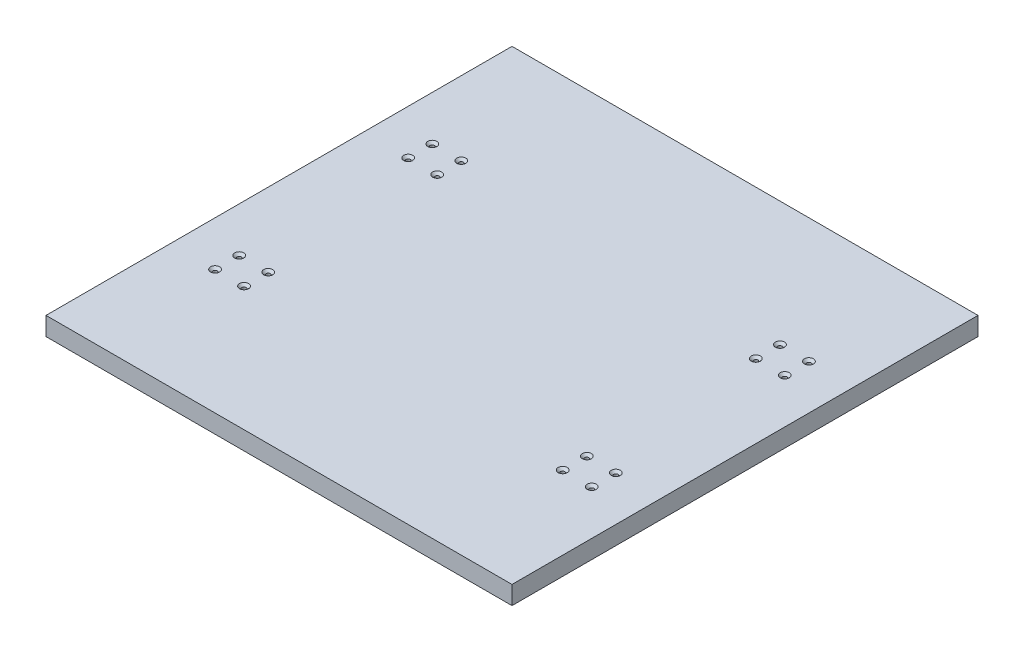
ISO-10303-21;
HEADER;
FILE_DESCRIPTION(('STEP AP214'),'2;1');
FILE_NAME('part.step','',(''),(''),'','','');
FILE_SCHEMA(('AUTOMOTIVE_DESIGN { 1 0 10303 214 1 1 1 1 }'));
ENDSEC;
DATA;
#1=APPLICATION_CONTEXT('core data for automotive mechanical design processes');
#2=APPLICATION_PROTOCOL_DEFINITION('international standard','automotive_design',2000,#1);
#3=PRODUCT_CONTEXT('',#1,'mechanical');
#4=PRODUCT('Part','Part','',(#3));
#5=PRODUCT_RELATED_PRODUCT_CATEGORY('part','',(#4));
#6=PRODUCT_DEFINITION_FORMATION('','',#4);
#7=PRODUCT_DEFINITION_CONTEXT('part definition',#1,'design');
#8=PRODUCT_DEFINITION('design','',#6,#7);
#9=PRODUCT_DEFINITION_SHAPE('','',#8);
#10=(LENGTH_UNIT() NAMED_UNIT(*) SI_UNIT(.MILLI.,.METRE.));
#11=(NAMED_UNIT(*) PLANE_ANGLE_UNIT() SI_UNIT($,.RADIAN.));
#12=(NAMED_UNIT(*) SI_UNIT($,.STERADIAN.) SOLID_ANGLE_UNIT());
#13=UNCERTAINTY_MEASURE_WITH_UNIT(LENGTH_MEASURE(1.E-05),#10,'distance_accuracy_value','');
#14=(GEOMETRIC_REPRESENTATION_CONTEXT(3) GLOBAL_UNCERTAINTY_ASSIGNED_CONTEXT((#13)) GLOBAL_UNIT_ASSIGNED_CONTEXT((#10,
#11,#12)) REPRESENTATION_CONTEXT('',''));
#15=CARTESIAN_POINT('',(0.,0.,0.));
#16=DIRECTION('',(0.,0.,1.));
#17=DIRECTION('',(1.,0.,0.));
#18=AXIS2_PLACEMENT_3D('',#15,#16,#17);
#19=CARTESIAN_POINT('',(-241.3,19.05,241.3));
#20=DIRECTION('',(1.,0.,0.));
#21=DIRECTION('',(0.,0.,-1.));
#22=AXIS2_PLACEMENT_3D('',#19,#20,#21);
#23=PLANE('',#22);
#24=DIRECTION('',(0.,0.,1.));
#25=VECTOR('',#24,1.);
#26=CARTESIAN_POINT('',(-241.3,0.,241.3));
#27=LINE('',#26,#25);
#28=CARTESIAN_POINT('',(-241.3,0.,-241.3));
#29=VERTEX_POINT('',#28);
#30=CARTESIAN_POINT('',(-241.3,0.,241.3));
#31=VERTEX_POINT('',#30);
#32=EDGE_CURVE('E108',#29,#31,#27,.T.);
#33=ORIENTED_EDGE('',*,*,#32,.T.);
#34=DIRECTION('',(0.,-1.,0.));
#35=VECTOR('',#34,1.);
#36=CARTESIAN_POINT('',(-241.3,19.05,241.3));
#37=LINE('',#36,#35);
#38=CARTESIAN_POINT('',(-241.3,19.05,241.3));
#39=VERTEX_POINT('',#38);
#40=EDGE_CURVE('E11',#39,#31,#37,.T.);
#41=ORIENTED_EDGE('',*,*,#40,.F.);
#42=DIRECTION('',(0.,0.,1.));
#43=VECTOR('',#42,1.);
#44=CARTESIAN_POINT('',(-241.3,19.05,241.3));
#45=LINE('',#44,#43);
#46=CARTESIAN_POINT('',(-241.3,19.05,-241.3));
#47=VERTEX_POINT('',#46);
#48=EDGE_CURVE('E92',#47,#39,#45,.T.);
#49=ORIENTED_EDGE('',*,*,#48,.F.);
#50=DIRECTION('',(0.,-1.,0.));
#51=VECTOR('',#50,1.);
#52=CARTESIAN_POINT('',(-241.3,19.05,-241.3));
#53=LINE('',#52,#51);
#54=EDGE_CURVE('E105',#47,#29,#53,.T.);
#55=ORIENTED_EDGE('',*,*,#54,.T.);
#56=EDGE_LOOP('',(#33,#41,#49,#55));
#57=FACE_BOUND('',#56,.T.);
#58=ADVANCED_FACE('F43',(#57),#23,.F.);
#59=CARTESIAN_POINT('',(241.3,19.05,241.3));
#60=DIRECTION('',(0.,0.,-1.));
#61=DIRECTION('',(-1.,0.,0.));
#62=AXIS2_PLACEMENT_3D('',#59,#60,#61);
#63=PLANE('',#62);
#64=DIRECTION('',(1.,0.,0.));
#65=VECTOR('',#64,1.);
#66=CARTESIAN_POINT('',(241.3,0.,241.3));
#67=LINE('',#66,#65);
#68=CARTESIAN_POINT('',(241.3,0.,241.3));
#69=VERTEX_POINT('',#68);
#70=EDGE_CURVE('E97',#31,#69,#67,.T.);
#71=ORIENTED_EDGE('',*,*,#70,.T.);
#72=DIRECTION('',(0.,-1.,0.));
#73=VECTOR('',#72,1.);
#74=CARTESIAN_POINT('',(241.3,19.05,241.3));
#75=LINE('',#74,#73);
#76=CARTESIAN_POINT('',(241.3,19.05,241.3));
#77=VERTEX_POINT('',#76);
#78=EDGE_CURVE('E51',#77,#69,#75,.T.);
#79=ORIENTED_EDGE('',*,*,#78,.F.);
#80=DIRECTION('',(1.,0.,0.));
#81=VECTOR('',#80,1.);
#82=CARTESIAN_POINT('',(241.3,19.05,241.3));
#83=LINE('',#82,#81);
#84=EDGE_CURVE('E87',#39,#77,#83,.T.);
#85=ORIENTED_EDGE('',*,*,#84,.F.);
#86=ORIENTED_EDGE('',*,*,#40,.T.);
#87=EDGE_LOOP('',(#71,#79,#85,#86));
#88=FACE_BOUND('',#87,.T.);
#89=ADVANCED_FACE('F100',(#88),#63,.F.);
#90=CARTESIAN_POINT('',(241.3,19.05,241.3));
#91=DIRECTION('',(-1.,0.,0.));
#92=DIRECTION('',(0.,0.,1.));
#93=AXIS2_PLACEMENT_3D('',#90,#91,#92);
#94=PLANE('',#93);
#95=DIRECTION('',(0.,0.,-1.));
#96=VECTOR('',#95,1.);
#97=CARTESIAN_POINT('',(241.3,0.,241.3));
#98=LINE('',#97,#96);
#99=CARTESIAN_POINT('',(241.3,0.,-241.3));
#100=VERTEX_POINT('',#99);
#101=EDGE_CURVE('E78',#69,#100,#98,.T.);
#102=ORIENTED_EDGE('',*,*,#101,.T.);
#103=DIRECTION('',(0.,-1.,0.));
#104=VECTOR('',#103,1.);
#105=CARTESIAN_POINT('',(241.3,19.05,-241.3));
#106=LINE('',#105,#104);
#107=CARTESIAN_POINT('',(241.3,19.05,-241.3));
#108=VERTEX_POINT('',#107);
#109=EDGE_CURVE('E98',#108,#100,#106,.T.);
#110=ORIENTED_EDGE('',*,*,#109,.F.);
#111=DIRECTION('',(0.,0.,-1.));
#112=VECTOR('',#111,1.);
#113=CARTESIAN_POINT('',(241.3,19.05,241.3));
#114=LINE('',#113,#112);
#115=EDGE_CURVE('E95',#77,#108,#114,.T.);
#116=ORIENTED_EDGE('',*,*,#115,.F.);
#117=ORIENTED_EDGE('',*,*,#78,.T.);
#118=EDGE_LOOP('',(#102,#110,#116,#117));
#119=FACE_BOUND('',#118,.T.);
#120=ADVANCED_FACE('F99',(#119),#94,.F.);
#121=CARTESIAN_POINT('',(241.3,19.05,-241.3));
#122=DIRECTION('',(0.,0.,1.));
#123=DIRECTION('',(1.,0.,0.));
#124=AXIS2_PLACEMENT_3D('',#121,#122,#123);
#125=PLANE('',#124);
#126=DIRECTION('',(-1.,0.,0.));
#127=VECTOR('',#126,1.);
#128=CARTESIAN_POINT('',(241.3,0.,-241.3));
#129=LINE('',#128,#127);
#130=EDGE_CURVE('E85',#100,#29,#129,.T.);
#131=ORIENTED_EDGE('',*,*,#130,.T.);
#132=ORIENTED_EDGE('',*,*,#54,.F.);
#133=DIRECTION('',(-1.,0.,0.));
#134=VECTOR('',#133,1.);
#135=CARTESIAN_POINT('',(241.3,19.05,-241.3));
#136=LINE('',#135,#134);
#137=EDGE_CURVE('E56',#108,#47,#136,.T.);
#138=ORIENTED_EDGE('',*,*,#137,.F.);
#139=ORIENTED_EDGE('',*,*,#109,.T.);
#140=EDGE_LOOP('',(#131,#132,#138,#139));
#141=FACE_BOUND('',#140,.T.);
#142=ADVANCED_FACE('F114',(#141),#125,.F.);
#143=CARTESIAN_POINT('',(0.,19.05,0.));
#144=DIRECTION('',(0.,1.,0.));
#145=DIRECTION('',(0.,0.,1.));
#146=AXIS2_PLACEMENT_3D('',#143,#144,#145);
#147=PLANE('',#146);
#148=CARTESIAN_POINT('',(-195.,19.05,87.5));
#149=DIRECTION('',(0.,1.,0.));
#150=DIRECTION('',(0.,0.,1.));
#151=AXIS2_PLACEMENT_3D('',#148,#149,#150);
#152=CIRCLE('',#151,4.70000000000001);
#153=CARTESIAN_POINT('',(-195.,19.05,92.2));
#154=VERTEX_POINT('',#153);
#155=EDGE_CURVE('E259',#154,#154,#152,.T.);
#156=ORIENTED_EDGE('',*,*,#155,.F.);
#157=EDGE_LOOP('',(#156));
#158=FACE_BOUND('',#157,.T.);
#159=CARTESIAN_POINT('',(-165.,19.05,87.5));
#160=DIRECTION('',(0.,1.,0.));
#161=DIRECTION('',(0.,0.,1.));
#162=AXIS2_PLACEMENT_3D('',#159,#160,#161);
#163=CIRCLE('',#162,4.70000000000001);
#164=CARTESIAN_POINT('',(-165.,19.05,92.2));
#165=VERTEX_POINT('',#164);
#166=EDGE_CURVE('E253',#165,#165,#163,.T.);
#167=ORIENTED_EDGE('',*,*,#166,.F.);
#168=EDGE_LOOP('',(#167));
#169=FACE_BOUND('',#168,.T.);
#170=CARTESIAN_POINT('',(-165.,19.05,112.5));
#171=DIRECTION('',(0.,1.,0.));
#172=DIRECTION('',(0.,0.,1.));
#173=AXIS2_PLACEMENT_3D('',#170,#171,#172);
#174=CIRCLE('',#173,4.70000000000001);
#175=CARTESIAN_POINT('',(-165.,19.05,117.2));
#176=VERTEX_POINT('',#175);
#177=EDGE_CURVE('E245',#176,#176,#174,.T.);
#178=ORIENTED_EDGE('',*,*,#177,.F.);
#179=EDGE_LOOP('',(#178));
#180=FACE_BOUND('',#179,.T.);
#181=CARTESIAN_POINT('',(-195.,19.05,112.5));
#182=DIRECTION('',(0.,1.,0.));
#183=DIRECTION('',(0.,0.,1.));
#184=AXIS2_PLACEMENT_3D('',#181,#182,#183);
#185=CIRCLE('',#184,4.70000000000001);
#186=CARTESIAN_POINT('',(-195.,19.05,117.2));
#187=VERTEX_POINT('',#186);
#188=EDGE_CURVE('E232',#187,#187,#185,.T.);
#189=ORIENTED_EDGE('',*,*,#188,.F.);
#190=EDGE_LOOP('',(#189));
#191=FACE_BOUND('',#190,.T.);
#192=CARTESIAN_POINT('',(195.,19.05,112.5));
#193=DIRECTION('',(0.,1.,0.));
#194=DIRECTION('',(0.,0.,1.));
#195=AXIS2_PLACEMENT_3D('',#192,#193,#194);
#196=CIRCLE('',#195,4.70000000000001);
#197=CARTESIAN_POINT('',(195.,19.05,117.2));
#198=VERTEX_POINT('',#197);
#199=EDGE_CURVE('E222',#198,#198,#196,.T.);
#200=ORIENTED_EDGE('',*,*,#199,.F.);
#201=EDGE_LOOP('',(#200));
#202=FACE_BOUND('',#201,.T.);
#203=CARTESIAN_POINT('',(165.,19.05,112.5));
#204=DIRECTION('',(0.,1.,0.));
#205=DIRECTION('',(0.,0.,1.));
#206=AXIS2_PLACEMENT_3D('',#203,#204,#205);
#207=CIRCLE('',#206,4.70000000000001);
#208=CARTESIAN_POINT('',(165.,19.05,117.2));
#209=VERTEX_POINT('',#208);
#210=EDGE_CURVE('E214',#209,#209,#207,.T.);
#211=ORIENTED_EDGE('',*,*,#210,.F.);
#212=EDGE_LOOP('',(#211));
#213=FACE_BOUND('',#212,.T.);
#214=CARTESIAN_POINT('',(165.,19.05,87.5000000000001));
#215=DIRECTION('',(0.,1.,0.));
#216=DIRECTION('',(0.,0.,1.));
#217=AXIS2_PLACEMENT_3D('',#214,#215,#216);
#218=CIRCLE('',#217,4.70000000000001);
#219=CARTESIAN_POINT('',(165.,19.05,92.2000000000001));
#220=VERTEX_POINT('',#219);
#221=EDGE_CURVE('E208',#220,#220,#218,.T.);
#222=ORIENTED_EDGE('',*,*,#221,.F.);
#223=EDGE_LOOP('',(#222));
#224=FACE_BOUND('',#223,.T.);
#225=CARTESIAN_POINT('',(195.,19.05,87.5000000000001));
#226=DIRECTION('',(0.,1.,0.));
#227=DIRECTION('',(0.,0.,1.));
#228=AXIS2_PLACEMENT_3D('',#225,#226,#227);
#229=CIRCLE('',#228,4.70000000000001);
#230=CARTESIAN_POINT('',(195.,19.05,92.2000000000001));
#231=VERTEX_POINT('',#230);
#232=EDGE_CURVE('E200',#231,#231,#229,.T.);
#233=ORIENTED_EDGE('',*,*,#232,.F.);
#234=EDGE_LOOP('',(#233));
#235=FACE_BOUND('',#234,.T.);
#236=CARTESIAN_POINT('',(195.,19.05,-87.5000000000002));
#237=DIRECTION('',(0.,1.,0.));
#238=DIRECTION('',(0.,0.,1.));
#239=AXIS2_PLACEMENT_3D('',#236,#237,#238);
#240=CIRCLE('',#239,4.70000000000001);
#241=CARTESIAN_POINT('',(195.,19.05,-82.8000000000002));
#242=VERTEX_POINT('',#241);
#243=EDGE_CURVE('E187',#242,#242,#240,.T.);
#244=ORIENTED_EDGE('',*,*,#243,.F.);
#245=EDGE_LOOP('',(#244));
#246=FACE_BOUND('',#245,.T.);
#247=CARTESIAN_POINT('',(195.,19.05,-112.5));
#248=DIRECTION('',(0.,1.,0.));
#249=DIRECTION('',(0.,0.,1.));
#250=AXIS2_PLACEMENT_3D('',#247,#248,#249);
#251=CIRCLE('',#250,4.70000000000001);
#252=CARTESIAN_POINT('',(195.,19.05,-107.8));
#253=VERTEX_POINT('',#252);
#254=EDGE_CURVE('E177',#253,#253,#251,.T.);
#255=ORIENTED_EDGE('',*,*,#254,.F.);
#256=EDGE_LOOP('',(#255));
#257=FACE_BOUND('',#256,.T.);
#258=CARTESIAN_POINT('',(165.,19.05,-112.5));
#259=DIRECTION('',(0.,1.,0.));
#260=DIRECTION('',(0.,0.,1.));
#261=AXIS2_PLACEMENT_3D('',#258,#259,#260);
#262=CIRCLE('',#261,4.70000000000001);
#263=CARTESIAN_POINT('',(165.,19.05,-107.8));
#264=VERTEX_POINT('',#263);
#265=EDGE_CURVE('E169',#264,#264,#262,.T.);
#266=ORIENTED_EDGE('',*,*,#265,.F.);
#267=EDGE_LOOP('',(#266));
#268=FACE_BOUND('',#267,.T.);
#269=CARTESIAN_POINT('',(165.,19.05,-87.5000000000001));
#270=DIRECTION('',(0.,1.,0.));
#271=DIRECTION('',(0.,0.,1.));
#272=AXIS2_PLACEMENT_3D('',#269,#270,#271);
#273=CIRCLE('',#272,4.70000000000001);
#274=CARTESIAN_POINT('',(165.,19.05,-82.8000000000001));
#275=VERTEX_POINT('',#274);
#276=EDGE_CURVE('E163',#275,#275,#273,.T.);
#277=ORIENTED_EDGE('',*,*,#276,.F.);
#278=EDGE_LOOP('',(#277));
#279=FACE_BOUND('',#278,.T.);
#280=CARTESIAN_POINT('',(-195.,19.05,-87.5));
#281=DIRECTION('',(0.,1.,0.));
#282=DIRECTION('',(0.,0.,1.));
#283=AXIS2_PLACEMENT_3D('',#280,#281,#282);
#284=CIRCLE('',#283,4.70000000000001);
#285=CARTESIAN_POINT('',(-195.,19.05,-82.8));
#286=VERTEX_POINT('',#285);
#287=EDGE_CURVE('E155',#286,#286,#284,.T.);
#288=ORIENTED_EDGE('',*,*,#287,.F.);
#289=EDGE_LOOP('',(#288));
#290=FACE_BOUND('',#289,.T.);
#291=CARTESIAN_POINT('',(-165.,19.05,-87.5));
#292=DIRECTION('',(0.,1.,0.));
#293=DIRECTION('',(0.,0.,1.));
#294=AXIS2_PLACEMENT_3D('',#291,#292,#293);
#295=CIRCLE('',#294,4.70000000000001);
#296=CARTESIAN_POINT('',(-165.,19.05,-82.8));
#297=VERTEX_POINT('',#296);
#298=EDGE_CURVE('E142',#297,#297,#295,.T.);
#299=ORIENTED_EDGE('',*,*,#298,.F.);
#300=EDGE_LOOP('',(#299));
#301=FACE_BOUND('',#300,.T.);
#302=CARTESIAN_POINT('',(-165.,19.05,-112.5));
#303=DIRECTION('',(0.,1.,0.));
#304=DIRECTION('',(0.,0.,1.));
#305=AXIS2_PLACEMENT_3D('',#302,#303,#304);
#306=CIRCLE('',#305,4.70000000000001);
#307=CARTESIAN_POINT('',(-165.,19.05,-107.8));
#308=VERTEX_POINT('',#307);
#309=EDGE_CURVE('E132',#308,#308,#306,.T.);
#310=ORIENTED_EDGE('',*,*,#309,.F.);
#311=EDGE_LOOP('',(#310));
#312=FACE_BOUND('',#311,.T.);
#313=CARTESIAN_POINT('',(-195.,19.05,-112.5));
#314=DIRECTION('',(0.,1.,0.));
#315=DIRECTION('',(0.,0.,1.));
#316=AXIS2_PLACEMENT_3D('',#313,#314,#315);
#317=CIRCLE('',#316,4.70000000000001);
#318=CARTESIAN_POINT('',(-195.,19.05,-107.8));
#319=VERTEX_POINT('',#318);
#320=EDGE_CURVE('E124',#319,#319,#317,.T.);
#321=ORIENTED_EDGE('',*,*,#320,.F.);
#322=EDGE_LOOP('',(#321));
#323=FACE_BOUND('',#322,.T.);
#324=ORIENTED_EDGE('',*,*,#48,.T.);
#325=ORIENTED_EDGE('',*,*,#84,.T.);
#326=ORIENTED_EDGE('',*,*,#115,.T.);
#327=ORIENTED_EDGE('',*,*,#137,.T.);
#328=EDGE_LOOP('',(#324,#325,#326,#327));
#329=FACE_BOUND('',#328,.T.);
#330=ADVANCED_FACE('F89',(#158,#169,#180,#191,#202,#213,#224,#235,#246,#257,#268,#279,#290,#301,
#312,#323,#329),#147,.T.);
#331=CARTESIAN_POINT('',(0.,0.,0.));
#332=DIRECTION('',(0.,1.,0.));
#333=DIRECTION('',(0.,0.,1.));
#334=AXIS2_PLACEMENT_3D('',#331,#332,#333);
#335=PLANE('',#334);
#336=CARTESIAN_POINT('',(-195.,0.,87.5));
#337=DIRECTION('',(0.,1.,0.));
#338=DIRECTION('',(0.,0.,1.));
#339=AXIS2_PLACEMENT_3D('',#336,#337,#338);
#340=CIRCLE('',#339,2.25);
#341=CARTESIAN_POINT('',(-195.,0.,89.75));
#342=VERTEX_POINT('',#341);
#343=EDGE_CURVE('E252',#342,#342,#340,.T.);
#344=ORIENTED_EDGE('',*,*,#343,.T.);
#345=EDGE_LOOP('',(#344));
#346=FACE_BOUND('',#345,.T.);
#347=CARTESIAN_POINT('',(-165.,0.,87.5));
#348=DIRECTION('',(0.,1.,0.));
#349=DIRECTION('',(0.,0.,1.));
#350=AXIS2_PLACEMENT_3D('',#347,#348,#349);
#351=CIRCLE('',#350,2.25);
#352=CARTESIAN_POINT('',(-165.,0.,89.75));
#353=VERTEX_POINT('',#352);
#354=EDGE_CURVE('E244',#353,#353,#351,.T.);
#355=ORIENTED_EDGE('',*,*,#354,.T.);
#356=EDGE_LOOP('',(#355));
#357=FACE_BOUND('',#356,.T.);
#358=CARTESIAN_POINT('',(-165.,0.,112.5));
#359=DIRECTION('',(0.,1.,0.));
#360=DIRECTION('',(0.,0.,1.));
#361=AXIS2_PLACEMENT_3D('',#358,#359,#360);
#362=CIRCLE('',#361,2.25);
#363=CARTESIAN_POINT('',(-165.,0.,114.75));
#364=VERTEX_POINT('',#363);
#365=EDGE_CURVE('E237',#364,#364,#362,.T.);
#366=ORIENTED_EDGE('',*,*,#365,.T.);
#367=EDGE_LOOP('',(#366));
#368=FACE_BOUND('',#367,.T.);
#369=CARTESIAN_POINT('',(-195.,0.,112.5));
#370=DIRECTION('',(0.,1.,0.));
#371=DIRECTION('',(0.,0.,1.));
#372=AXIS2_PLACEMENT_3D('',#369,#370,#371);
#373=CIRCLE('',#372,2.25);
#374=CARTESIAN_POINT('',(-195.,0.,114.75));
#375=VERTEX_POINT('',#374);
#376=EDGE_CURVE('E230',#375,#375,#373,.T.);
#377=ORIENTED_EDGE('',*,*,#376,.T.);
#378=EDGE_LOOP('',(#377));
#379=FACE_BOUND('',#378,.T.);
#380=CARTESIAN_POINT('',(195.,0.,112.5));
#381=DIRECTION('',(0.,1.,0.));
#382=DIRECTION('',(0.,0.,1.));
#383=AXIS2_PLACEMENT_3D('',#380,#381,#382);
#384=CIRCLE('',#383,2.25);
#385=CARTESIAN_POINT('',(195.,0.,114.75));
#386=VERTEX_POINT('',#385);
#387=EDGE_CURVE('E216',#386,#386,#384,.T.);
#388=ORIENTED_EDGE('',*,*,#387,.T.);
#389=EDGE_LOOP('',(#388));
#390=FACE_BOUND('',#389,.T.);
#391=CARTESIAN_POINT('',(165.,0.,112.5));
#392=DIRECTION('',(0.,1.,0.));
#393=DIRECTION('',(0.,0.,1.));
#394=AXIS2_PLACEMENT_3D('',#391,#392,#393);
#395=CIRCLE('',#394,2.25);
#396=CARTESIAN_POINT('',(165.,0.,114.75));
#397=VERTEX_POINT('',#396);
#398=EDGE_CURVE('E207',#397,#397,#395,.T.);
#399=ORIENTED_EDGE('',*,*,#398,.T.);
#400=EDGE_LOOP('',(#399));
#401=FACE_BOUND('',#400,.T.);
#402=CARTESIAN_POINT('',(165.,0.,87.5000000000001));
#403=DIRECTION('',(0.,1.,0.));
#404=DIRECTION('',(0.,0.,1.));
#405=AXIS2_PLACEMENT_3D('',#402,#403,#404);
#406=CIRCLE('',#405,2.25);
#407=CARTESIAN_POINT('',(165.,0.,89.7500000000001));
#408=VERTEX_POINT('',#407);
#409=EDGE_CURVE('E199',#408,#408,#406,.T.);
#410=ORIENTED_EDGE('',*,*,#409,.T.);
#411=EDGE_LOOP('',(#410));
#412=FACE_BOUND('',#411,.T.);
#413=CARTESIAN_POINT('',(195.,0.,87.5000000000001));
#414=DIRECTION('',(0.,1.,0.));
#415=DIRECTION('',(0.,0.,1.));
#416=AXIS2_PLACEMENT_3D('',#413,#414,#415);
#417=CIRCLE('',#416,2.25);
#418=CARTESIAN_POINT('',(195.,0.,89.7500000000001));
#419=VERTEX_POINT('',#418);
#420=EDGE_CURVE('E192',#419,#419,#417,.T.);
#421=ORIENTED_EDGE('',*,*,#420,.T.);
#422=EDGE_LOOP('',(#421));
#423=FACE_BOUND('',#422,.T.);
#424=CARTESIAN_POINT('',(195.,0.,-87.5000000000002));
#425=DIRECTION('',(0.,1.,0.));
#426=DIRECTION('',(0.,0.,1.));
#427=AXIS2_PLACEMENT_3D('',#424,#425,#426);
#428=CIRCLE('',#427,2.25);
#429=CARTESIAN_POINT('',(195.,0.,-85.2500000000002));
#430=VERTEX_POINT('',#429);
#431=EDGE_CURVE('E185',#430,#430,#428,.T.);
#432=ORIENTED_EDGE('',*,*,#431,.T.);
#433=EDGE_LOOP('',(#432));
#434=FACE_BOUND('',#433,.T.);
#435=CARTESIAN_POINT('',(195.,0.,-112.5));
#436=DIRECTION('',(0.,1.,0.));
#437=DIRECTION('',(0.,0.,1.));
#438=AXIS2_PLACEMENT_3D('',#435,#436,#437);
#439=CIRCLE('',#438,2.25);
#440=CARTESIAN_POINT('',(195.,0.,-110.25));
#441=VERTEX_POINT('',#440);
#442=EDGE_CURVE('E171',#441,#441,#439,.T.);
#443=ORIENTED_EDGE('',*,*,#442,.T.);
#444=EDGE_LOOP('',(#443));
#445=FACE_BOUND('',#444,.T.);
#446=CARTESIAN_POINT('',(165.,0.,-112.5));
#447=DIRECTION('',(0.,1.,0.));
#448=DIRECTION('',(0.,0.,1.));
#449=AXIS2_PLACEMENT_3D('',#446,#447,#448);
#450=CIRCLE('',#449,2.25);
#451=CARTESIAN_POINT('',(165.,0.,-110.25));
#452=VERTEX_POINT('',#451);
#453=EDGE_CURVE('E162',#452,#452,#450,.T.);
#454=ORIENTED_EDGE('',*,*,#453,.T.);
#455=EDGE_LOOP('',(#454));
#456=FACE_BOUND('',#455,.T.);
#457=CARTESIAN_POINT('',(165.,0.,-87.5000000000001));
#458=DIRECTION('',(0.,1.,0.));
#459=DIRECTION('',(0.,0.,1.));
#460=AXIS2_PLACEMENT_3D('',#457,#458,#459);
#461=CIRCLE('',#460,2.25);
#462=CARTESIAN_POINT('',(165.,0.,-85.2500000000001));
#463=VERTEX_POINT('',#462);
#464=EDGE_CURVE('E154',#463,#463,#461,.T.);
#465=ORIENTED_EDGE('',*,*,#464,.T.);
#466=EDGE_LOOP('',(#465));
#467=FACE_BOUND('',#466,.T.);
#468=CARTESIAN_POINT('',(-195.,0.,-87.5));
#469=DIRECTION('',(0.,1.,0.));
#470=DIRECTION('',(0.,0.,1.));
#471=AXIS2_PLACEMENT_3D('',#468,#469,#470);
#472=CIRCLE('',#471,2.25);
#473=CARTESIAN_POINT('',(-195.,0.,-85.25));
#474=VERTEX_POINT('',#473);
#475=EDGE_CURVE('E147',#474,#474,#472,.T.);
#476=ORIENTED_EDGE('',*,*,#475,.T.);
#477=EDGE_LOOP('',(#476));
#478=FACE_BOUND('',#477,.T.);
#479=CARTESIAN_POINT('',(-165.,0.,-87.5));
#480=DIRECTION('',(0.,1.,0.));
#481=DIRECTION('',(0.,0.,1.));
#482=AXIS2_PLACEMENT_3D('',#479,#480,#481);
#483=CIRCLE('',#482,2.25);
#484=CARTESIAN_POINT('',(-165.,0.,-85.25));
#485=VERTEX_POINT('',#484);
#486=EDGE_CURVE('E140',#485,#485,#483,.T.);
#487=ORIENTED_EDGE('',*,*,#486,.T.);
#488=EDGE_LOOP('',(#487));
#489=FACE_BOUND('',#488,.T.);
#490=CARTESIAN_POINT('',(-165.,0.,-112.5));
#491=DIRECTION('',(0.,1.,0.));
#492=DIRECTION('',(0.,0.,1.));
#493=AXIS2_PLACEMENT_3D('',#490,#491,#492);
#494=CIRCLE('',#493,2.25);
#495=CARTESIAN_POINT('',(-165.,0.,-110.25));
#496=VERTEX_POINT('',#495);
#497=EDGE_CURVE('E126',#496,#496,#494,.T.);
#498=ORIENTED_EDGE('',*,*,#497,.T.);
#499=EDGE_LOOP('',(#498));
#500=FACE_BOUND('',#499,.T.);
#501=CARTESIAN_POINT('',(-195.,0.,-112.5));
#502=DIRECTION('',(0.,1.,0.));
#503=DIRECTION('',(0.,0.,1.));
#504=AXIS2_PLACEMENT_3D('',#501,#502,#503);
#505=CIRCLE('',#504,2.25);
#506=CARTESIAN_POINT('',(-195.,0.,-110.25));
#507=VERTEX_POINT('',#506);
#508=EDGE_CURVE('E107',#507,#507,#505,.T.);
#509=ORIENTED_EDGE('',*,*,#508,.T.);
#510=EDGE_LOOP('',(#509));
#511=FACE_BOUND('',#510,.T.);
#512=ORIENTED_EDGE('',*,*,#32,.F.);
#513=ORIENTED_EDGE('',*,*,#130,.F.);
#514=ORIENTED_EDGE('',*,*,#101,.F.);
#515=ORIENTED_EDGE('',*,*,#70,.F.);
#516=EDGE_LOOP('',(#512,#513,#514,#515));
#517=FACE_BOUND('',#516,.T.);
#518=ADVANCED_FACE('F120',(#346,#357,#368,#379,#390,#401,#412,#423,#434,#445,#456,#467,#478,
#489,#500,#511,#517),#335,.F.);
#519=CARTESIAN_POINT('',(-195.,19.05,-112.5));
#520=DIRECTION('',(0.,1.,0.));
#521=DIRECTION('',(0.,0.,1.));
#522=AXIS2_PLACEMENT_3D('',#519,#520,#521);
#523=CYLINDRICAL_SURFACE('',#522,2.25);
#524=ORIENTED_EDGE('',*,*,#508,.F.);
#525=EDGE_LOOP('',(#524));
#526=FACE_BOUND('',#525,.T.);
#527=CARTESIAN_POINT('',(-195.,16.6,-112.5));
#528=DIRECTION('',(0.,1.,0.));
#529=DIRECTION('',(0.,0.,1.));
#530=AXIS2_PLACEMENT_3D('',#527,#528,#529);
#531=CIRCLE('',#530,2.25);
#532=CARTESIAN_POINT('',(-195.,16.6,-110.25));
#533=VERTEX_POINT('',#532);
#534=EDGE_CURVE('E122',#533,#533,#531,.T.);
#535=ORIENTED_EDGE('',*,*,#534,.T.);
#536=EDGE_LOOP('',(#535));
#537=FACE_BOUND('',#536,.T.);
#538=ADVANCED_FACE('F302',(#526,#537),#523,.F.);
#539=CARTESIAN_POINT('',(-195.,19.05,-112.5));
#540=DIRECTION('',(0.,1.,0.));
#541=DIRECTION('',(0.,0.,1.));
#542=AXIS2_PLACEMENT_3D('',#539,#540,#541);
#543=CONICAL_SURFACE('',#542,4.70000000000001,0.78539816339745);
#544=ORIENTED_EDGE('',*,*,#534,.F.);
#545=EDGE_LOOP('',(#544));
#546=FACE_BOUND('',#545,.T.);
#547=ORIENTED_EDGE('',*,*,#320,.T.);
#548=EDGE_LOOP('',(#547));
#549=FACE_BOUND('',#548,.T.);
#550=ADVANCED_FACE('F297',(#546,#549),#543,.F.);
#551=CARTESIAN_POINT('',(-165.,19.05,-112.5));
#552=DIRECTION('',(0.,1.,0.));
#553=DIRECTION('',(0.,0.,1.));
#554=AXIS2_PLACEMENT_3D('',#551,#552,#553);
#555=CYLINDRICAL_SURFACE('',#554,2.25);
#556=ORIENTED_EDGE('',*,*,#497,.F.);
#557=EDGE_LOOP('',(#556));
#558=FACE_BOUND('',#557,.T.);
#559=CARTESIAN_POINT('',(-165.,16.6,-112.5));
#560=DIRECTION('',(0.,1.,0.));
#561=DIRECTION('',(0.,0.,1.));
#562=AXIS2_PLACEMENT_3D('',#559,#560,#561);
#563=CIRCLE('',#562,2.25);
#564=CARTESIAN_POINT('',(-165.,16.6,-110.25));
#565=VERTEX_POINT('',#564);
#566=EDGE_CURVE('E131',#565,#565,#563,.T.);
#567=ORIENTED_EDGE('',*,*,#566,.T.);
#568=EDGE_LOOP('',(#567));
#569=FACE_BOUND('',#568,.T.);
#570=ADVANCED_FACE('F303',(#558,#569),#555,.F.);
#571=CARTESIAN_POINT('',(-165.,19.05,-112.5));
#572=DIRECTION('',(0.,1.,0.));
#573=DIRECTION('',(0.,0.,1.));
#574=AXIS2_PLACEMENT_3D('',#571,#572,#573);
#575=CONICAL_SURFACE('',#574,4.70000000000001,0.78539816339745);
#576=ORIENTED_EDGE('',*,*,#566,.F.);
#577=EDGE_LOOP('',(#576));
#578=FACE_BOUND('',#577,.T.);
#579=ORIENTED_EDGE('',*,*,#309,.T.);
#580=EDGE_LOOP('',(#579));
#581=FACE_BOUND('',#580,.T.);
#582=ADVANCED_FACE('F309',(#578,#581),#575,.F.);
#583=CARTESIAN_POINT('',(-165.,19.05,-87.5));
#584=DIRECTION('',(0.,1.,0.));
#585=DIRECTION('',(0.,0.,1.));
#586=AXIS2_PLACEMENT_3D('',#583,#584,#585);
#587=CYLINDRICAL_SURFACE('',#586,2.25);
#588=ORIENTED_EDGE('',*,*,#486,.F.);
#589=EDGE_LOOP('',(#588));
#590=FACE_BOUND('',#589,.T.);
#591=CARTESIAN_POINT('',(-165.,16.6,-87.5));
#592=DIRECTION('',(0.,1.,0.));
#593=DIRECTION('',(0.,0.,1.));
#594=AXIS2_PLACEMENT_3D('',#591,#592,#593);
#595=CIRCLE('',#594,2.25);
#596=CARTESIAN_POINT('',(-165.,16.6,-85.25));
#597=VERTEX_POINT('',#596);
#598=EDGE_CURVE('E139',#597,#597,#595,.T.);
#599=ORIENTED_EDGE('',*,*,#598,.T.);
#600=EDGE_LOOP('',(#599));
#601=FACE_BOUND('',#600,.T.);
#602=ADVANCED_FACE('F370',(#590,#601),#587,.F.);
#603=CARTESIAN_POINT('',(-165.,19.05,-87.5));
#604=DIRECTION('',(0.,1.,0.));
#605=DIRECTION('',(0.,0.,1.));
#606=AXIS2_PLACEMENT_3D('',#603,#604,#605);
#607=CONICAL_SURFACE('',#606,4.70000000000001,0.78539816339745);
#608=ORIENTED_EDGE('',*,*,#598,.F.);
#609=EDGE_LOOP('',(#608));
#610=FACE_BOUND('',#609,.T.);
#611=ORIENTED_EDGE('',*,*,#298,.T.);
#612=EDGE_LOOP('',(#611));
#613=FACE_BOUND('',#612,.T.);
#614=ADVANCED_FACE('F375',(#610,#613),#607,.F.);
#615=CARTESIAN_POINT('',(-195.,19.05,-87.5));
#616=DIRECTION('',(0.,1.,0.));
#617=DIRECTION('',(0.,0.,1.));
#618=AXIS2_PLACEMENT_3D('',#615,#616,#617);
#619=CYLINDRICAL_SURFACE('',#618,2.25);
#620=ORIENTED_EDGE('',*,*,#475,.F.);
#621=EDGE_LOOP('',(#620));
#622=FACE_BOUND('',#621,.T.);
#623=CARTESIAN_POINT('',(-195.,16.6,-87.5));
#624=DIRECTION('',(0.,1.,0.));
#625=DIRECTION('',(0.,0.,1.));
#626=AXIS2_PLACEMENT_3D('',#623,#624,#625);
#627=CIRCLE('',#626,2.25);
#628=CARTESIAN_POINT('',(-195.,16.6,-85.25));
#629=VERTEX_POINT('',#628);
#630=EDGE_CURVE('E146',#629,#629,#627,.T.);
#631=ORIENTED_EDGE('',*,*,#630,.T.);
#632=EDGE_LOOP('',(#631));
#633=FACE_BOUND('',#632,.T.);
#634=ADVANCED_FACE('F376',(#622,#633),#619,.F.);
#635=CARTESIAN_POINT('',(-195.,19.05,-87.5));
#636=DIRECTION('',(0.,1.,0.));
#637=DIRECTION('',(0.,0.,1.));
#638=AXIS2_PLACEMENT_3D('',#635,#636,#637);
#639=CONICAL_SURFACE('',#638,4.70000000000001,0.78539816339745);
#640=ORIENTED_EDGE('',*,*,#630,.F.);
#641=EDGE_LOOP('',(#640));
#642=FACE_BOUND('',#641,.T.);
#643=ORIENTED_EDGE('',*,*,#287,.T.);
#644=EDGE_LOOP('',(#643));
#645=FACE_BOUND('',#644,.T.);
#646=ADVANCED_FACE('F385',(#642,#645),#639,.F.);
#647=CARTESIAN_POINT('',(165.,19.05,-87.5000000000001));
#648=DIRECTION('',(0.,1.,0.));
#649=DIRECTION('',(0.,0.,1.));
#650=AXIS2_PLACEMENT_3D('',#647,#648,#649);
#651=CYLINDRICAL_SURFACE('',#650,2.25);
#652=ORIENTED_EDGE('',*,*,#464,.F.);
#653=EDGE_LOOP('',(#652));
#654=FACE_BOUND('',#653,.T.);
#655=CARTESIAN_POINT('',(165.,16.6,-87.5000000000001));
#656=DIRECTION('',(0.,1.,0.));
#657=DIRECTION('',(0.,0.,1.));
#658=AXIS2_PLACEMENT_3D('',#655,#656,#657);
#659=CIRCLE('',#658,2.25);
#660=CARTESIAN_POINT('',(165.,16.6,-85.2500000000001));
#661=VERTEX_POINT('',#660);
#662=EDGE_CURVE('E156',#661,#661,#659,.T.);
#663=ORIENTED_EDGE('',*,*,#662,.T.);
#664=EDGE_LOOP('',(#663));
#665=FACE_BOUND('',#664,.T.);
#666=ADVANCED_FACE('F388',(#654,#665),#651,.F.);
#667=CARTESIAN_POINT('',(165.,19.05,-87.5000000000001));
#668=DIRECTION('',(0.,1.,0.));
#669=DIRECTION('',(0.,0.,1.));
#670=AXIS2_PLACEMENT_3D('',#667,#668,#669);
#671=CONICAL_SURFACE('',#670,4.70000000000001,0.78539816339745);
#672=ORIENTED_EDGE('',*,*,#662,.F.);
#673=EDGE_LOOP('',(#672));
#674=FACE_BOUND('',#673,.T.);
#675=ORIENTED_EDGE('',*,*,#276,.T.);
#676=EDGE_LOOP('',(#675));
#677=FACE_BOUND('',#676,.T.);
#678=ADVANCED_FACE('F389',(#674,#677),#671,.F.);
#679=CARTESIAN_POINT('',(165.,19.05,-112.5));
#680=DIRECTION('',(0.,1.,0.));
#681=DIRECTION('',(0.,0.,1.));
#682=AXIS2_PLACEMENT_3D('',#679,#680,#681);
#683=CYLINDRICAL_SURFACE('',#682,2.25);
#684=ORIENTED_EDGE('',*,*,#453,.F.);
#685=EDGE_LOOP('',(#684));
#686=FACE_BOUND('',#685,.T.);
#687=CARTESIAN_POINT('',(165.,16.6,-112.5));
#688=DIRECTION('',(0.,1.,0.));
#689=DIRECTION('',(0.,0.,1.));
#690=AXIS2_PLACEMENT_3D('',#687,#688,#689);
#691=CIRCLE('',#690,2.25);
#692=CARTESIAN_POINT('',(165.,16.6,-110.25));
#693=VERTEX_POINT('',#692);
#694=EDGE_CURVE('E167',#693,#693,#691,.T.);
#695=ORIENTED_EDGE('',*,*,#694,.T.);
#696=EDGE_LOOP('',(#695));
#697=FACE_BOUND('',#696,.T.);
#698=ADVANCED_FACE('F395',(#686,#697),#683,.F.);
#699=CARTESIAN_POINT('',(165.,19.05,-112.5));
#700=DIRECTION('',(0.,1.,0.));
#701=DIRECTION('',(0.,0.,1.));
#702=AXIS2_PLACEMENT_3D('',#699,#700,#701);
#703=CONICAL_SURFACE('',#702,4.70000000000001,0.78539816339745);
#704=ORIENTED_EDGE('',*,*,#694,.F.);
#705=EDGE_LOOP('',(#704));
#706=FACE_BOUND('',#705,.T.);
#707=ORIENTED_EDGE('',*,*,#265,.T.);
#708=EDGE_LOOP('',(#707));
#709=FACE_BOUND('',#708,.T.);
#710=ADVANCED_FACE('F396',(#706,#709),#703,.F.);
#711=CARTESIAN_POINT('',(195.,19.05,-112.5));
#712=DIRECTION('',(0.,1.,0.));
#713=DIRECTION('',(0.,0.,1.));
#714=AXIS2_PLACEMENT_3D('',#711,#712,#713);
#715=CYLINDRICAL_SURFACE('',#714,2.25);
#716=ORIENTED_EDGE('',*,*,#442,.F.);
#717=EDGE_LOOP('',(#716));
#718=FACE_BOUND('',#717,.T.);
#719=CARTESIAN_POINT('',(195.,16.6,-112.5));
#720=DIRECTION('',(0.,1.,0.));
#721=DIRECTION('',(0.,0.,1.));
#722=AXIS2_PLACEMENT_3D('',#719,#720,#721);
#723=CIRCLE('',#722,2.25);
#724=CARTESIAN_POINT('',(195.,16.6,-110.25));
#725=VERTEX_POINT('',#724);
#726=EDGE_CURVE('E176',#725,#725,#723,.T.);
#727=ORIENTED_EDGE('',*,*,#726,.T.);
#728=EDGE_LOOP('',(#727));
#729=FACE_BOUND('',#728,.T.);
#730=ADVANCED_FACE('F405',(#718,#729),#715,.F.);
#731=CARTESIAN_POINT('',(195.,19.05,-112.5));
#732=DIRECTION('',(0.,1.,0.));
#733=DIRECTION('',(0.,0.,1.));
#734=AXIS2_PLACEMENT_3D('',#731,#732,#733);
#735=CONICAL_SURFACE('',#734,4.70000000000001,0.78539816339745);
#736=ORIENTED_EDGE('',*,*,#726,.F.);
#737=EDGE_LOOP('',(#736));
#738=FACE_BOUND('',#737,.T.);
#739=ORIENTED_EDGE('',*,*,#254,.T.);
#740=EDGE_LOOP('',(#739));
#741=FACE_BOUND('',#740,.T.);
#742=ADVANCED_FACE('F406',(#738,#741),#735,.F.);
#743=CARTESIAN_POINT('',(195.,19.05,-87.5000000000002));
#744=DIRECTION('',(0.,1.,0.));
#745=DIRECTION('',(0.,0.,1.));
#746=AXIS2_PLACEMENT_3D('',#743,#744,#745);
#747=CYLINDRICAL_SURFACE('',#746,2.25);
#748=ORIENTED_EDGE('',*,*,#431,.F.);
#749=EDGE_LOOP('',(#748));
#750=FACE_BOUND('',#749,.T.);
#751=CARTESIAN_POINT('',(195.,16.6,-87.5000000000002));
#752=DIRECTION('',(0.,1.,0.));
#753=DIRECTION('',(0.,0.,1.));
#754=AXIS2_PLACEMENT_3D('',#751,#752,#753);
#755=CIRCLE('',#754,2.25);
#756=CARTESIAN_POINT('',(195.,16.6,-85.2500000000002));
#757=VERTEX_POINT('',#756);
#758=EDGE_CURVE('E184',#757,#757,#755,.T.);
#759=ORIENTED_EDGE('',*,*,#758,.T.);
#760=EDGE_LOOP('',(#759));
#761=FACE_BOUND('',#760,.T.);
#762=ADVANCED_FACE('F409',(#750,#761),#747,.F.);
#763=CARTESIAN_POINT('',(195.,19.05,-87.5000000000002));
#764=DIRECTION('',(0.,1.,0.));
#765=DIRECTION('',(0.,0.,1.));
#766=AXIS2_PLACEMENT_3D('',#763,#764,#765);
#767=CONICAL_SURFACE('',#766,4.70000000000001,0.78539816339745);
#768=ORIENTED_EDGE('',*,*,#758,.F.);
#769=EDGE_LOOP('',(#768));
#770=FACE_BOUND('',#769,.T.);
#771=ORIENTED_EDGE('',*,*,#243,.T.);
#772=EDGE_LOOP('',(#771));
#773=FACE_BOUND('',#772,.T.);
#774=ADVANCED_FACE('F413',(#770,#773),#767,.F.);
#775=CARTESIAN_POINT('',(195.,19.05,87.5000000000001));
#776=DIRECTION('',(0.,1.,0.));
#777=DIRECTION('',(0.,0.,1.));
#778=AXIS2_PLACEMENT_3D('',#775,#776,#777);
#779=CYLINDRICAL_SURFACE('',#778,2.25);
#780=ORIENTED_EDGE('',*,*,#420,.F.);
#781=EDGE_LOOP('',(#780));
#782=FACE_BOUND('',#781,.T.);
#783=CARTESIAN_POINT('',(195.,16.6,87.5000000000001));
#784=DIRECTION('',(0.,1.,0.));
#785=DIRECTION('',(0.,0.,1.));
#786=AXIS2_PLACEMENT_3D('',#783,#784,#785);
#787=CIRCLE('',#786,2.25);
#788=CARTESIAN_POINT('',(195.,16.6,89.7500000000001));
#789=VERTEX_POINT('',#788);
#790=EDGE_CURVE('E191',#789,#789,#787,.T.);
#791=ORIENTED_EDGE('',*,*,#790,.T.);
#792=EDGE_LOOP('',(#791));
#793=FACE_BOUND('',#792,.T.);
#794=ADVANCED_FACE('F419',(#782,#793),#779,.F.);
#795=CARTESIAN_POINT('',(195.,19.05,87.5000000000001));
#796=DIRECTION('',(0.,1.,0.));
#797=DIRECTION('',(0.,0.,1.));
#798=AXIS2_PLACEMENT_3D('',#795,#796,#797);
#799=CONICAL_SURFACE('',#798,4.70000000000001,0.78539816339745);
#800=ORIENTED_EDGE('',*,*,#790,.F.);
#801=EDGE_LOOP('',(#800));
#802=FACE_BOUND('',#801,.T.);
#803=ORIENTED_EDGE('',*,*,#232,.T.);
#804=EDGE_LOOP('',(#803));
#805=FACE_BOUND('',#804,.T.);
#806=ADVANCED_FACE('F425',(#802,#805),#799,.F.);
#807=CARTESIAN_POINT('',(165.,19.05,87.5000000000001));
#808=DIRECTION('',(0.,1.,0.));
#809=DIRECTION('',(0.,0.,1.));
#810=AXIS2_PLACEMENT_3D('',#807,#808,#809);
#811=CYLINDRICAL_SURFACE('',#810,2.25);
#812=ORIENTED_EDGE('',*,*,#409,.F.);
#813=EDGE_LOOP('',(#812));
#814=FACE_BOUND('',#813,.T.);
#815=CARTESIAN_POINT('',(165.,16.6,87.5000000000001));
#816=DIRECTION('',(0.,1.,0.));
#817=DIRECTION('',(0.,0.,1.));
#818=AXIS2_PLACEMENT_3D('',#815,#816,#817);
#819=CIRCLE('',#818,2.25);
#820=CARTESIAN_POINT('',(165.,16.6,89.7500000000001));
#821=VERTEX_POINT('',#820);
#822=EDGE_CURVE('E201',#821,#821,#819,.T.);
#823=ORIENTED_EDGE('',*,*,#822,.T.);
#824=EDGE_LOOP('',(#823));
#825=FACE_BOUND('',#824,.T.);
#826=ADVANCED_FACE('F427',(#814,#825),#811,.F.);
#827=CARTESIAN_POINT('',(165.,19.05,87.5000000000001));
#828=DIRECTION('',(0.,1.,0.));
#829=DIRECTION('',(0.,0.,1.));
#830=AXIS2_PLACEMENT_3D('',#827,#828,#829);
#831=CONICAL_SURFACE('',#830,4.70000000000001,0.78539816339745);
#832=ORIENTED_EDGE('',*,*,#822,.F.);
#833=EDGE_LOOP('',(#832));
#834=FACE_BOUND('',#833,.T.);
#835=ORIENTED_EDGE('',*,*,#221,.T.);
#836=EDGE_LOOP('',(#835));
#837=FACE_BOUND('',#836,.T.);
#838=ADVANCED_FACE('F428',(#834,#837),#831,.F.);
#839=CARTESIAN_POINT('',(165.,19.05,112.5));
#840=DIRECTION('',(0.,1.,0.));
#841=DIRECTION('',(0.,0.,1.));
#842=AXIS2_PLACEMENT_3D('',#839,#840,#841);
#843=CYLINDRICAL_SURFACE('',#842,2.25);
#844=ORIENTED_EDGE('',*,*,#398,.F.);
#845=EDGE_LOOP('',(#844));
#846=FACE_BOUND('',#845,.T.);
#847=CARTESIAN_POINT('',(165.,16.6,112.5));
#848=DIRECTION('',(0.,1.,0.));
#849=DIRECTION('',(0.,0.,1.));
#850=AXIS2_PLACEMENT_3D('',#847,#848,#849);
#851=CIRCLE('',#850,2.25);
#852=CARTESIAN_POINT('',(165.,16.6,114.75));
#853=VERTEX_POINT('',#852);
#854=EDGE_CURVE('E212',#853,#853,#851,.T.);
#855=ORIENTED_EDGE('',*,*,#854,.T.);
#856=EDGE_LOOP('',(#855));
#857=FACE_BOUND('',#856,.T.);
#858=ADVANCED_FACE('F432',(#846,#857),#843,.F.);
#859=CARTESIAN_POINT('',(165.,19.05,112.5));
#860=DIRECTION('',(0.,1.,0.));
#861=DIRECTION('',(0.,0.,1.));
#862=AXIS2_PLACEMENT_3D('',#859,#860,#861);
#863=CONICAL_SURFACE('',#862,4.70000000000001,0.78539816339745);
#864=ORIENTED_EDGE('',*,*,#854,.F.);
#865=EDGE_LOOP('',(#864));
#866=FACE_BOUND('',#865,.T.);
#867=ORIENTED_EDGE('',*,*,#210,.T.);
#868=EDGE_LOOP('',(#867));
#869=FACE_BOUND('',#868,.T.);
#870=ADVANCED_FACE('F436',(#866,#869),#863,.F.);
#871=CARTESIAN_POINT('',(195.,19.05,112.5));
#872=DIRECTION('',(0.,1.,0.));
#873=DIRECTION('',(0.,0.,1.));
#874=AXIS2_PLACEMENT_3D('',#871,#872,#873);
#875=CYLINDRICAL_SURFACE('',#874,2.25);
#876=ORIENTED_EDGE('',*,*,#387,.F.);
#877=EDGE_LOOP('',(#876));
#878=FACE_BOUND('',#877,.T.);
#879=CARTESIAN_POINT('',(195.,16.6,112.5));
#880=DIRECTION('',(0.,1.,0.));
#881=DIRECTION('',(0.,0.,1.));
#882=AXIS2_PLACEMENT_3D('',#879,#880,#881);
#883=CIRCLE('',#882,2.25);
#884=CARTESIAN_POINT('',(195.,16.6,114.75));
#885=VERTEX_POINT('',#884);
#886=EDGE_CURVE('E221',#885,#885,#883,.T.);
#887=ORIENTED_EDGE('',*,*,#886,.T.);
#888=EDGE_LOOP('',(#887));
#889=FACE_BOUND('',#888,.T.);
#890=ADVANCED_FACE('F445',(#878,#889),#875,.F.);
#891=CARTESIAN_POINT('',(195.,19.05,112.5));
#892=DIRECTION('',(0.,1.,0.));
#893=DIRECTION('',(0.,0.,1.));
#894=AXIS2_PLACEMENT_3D('',#891,#892,#893);
#895=CONICAL_SURFACE('',#894,4.70000000000001,0.78539816339745);
#896=ORIENTED_EDGE('',*,*,#886,.F.);
#897=EDGE_LOOP('',(#896));
#898=FACE_BOUND('',#897,.T.);
#899=ORIENTED_EDGE('',*,*,#199,.T.);
#900=EDGE_LOOP('',(#899));
#901=FACE_BOUND('',#900,.T.);
#902=ADVANCED_FACE('F446',(#898,#901),#895,.F.);
#903=CARTESIAN_POINT('',(-195.,19.05,112.5));
#904=DIRECTION('',(0.,1.,0.));
#905=DIRECTION('',(0.,0.,1.));
#906=AXIS2_PLACEMENT_3D('',#903,#904,#905);
#907=CYLINDRICAL_SURFACE('',#906,2.25);
#908=ORIENTED_EDGE('',*,*,#376,.F.);
#909=EDGE_LOOP('',(#908));
#910=FACE_BOUND('',#909,.T.);
#911=CARTESIAN_POINT('',(-195.,16.6,112.5));
#912=DIRECTION('',(0.,1.,0.));
#913=DIRECTION('',(0.,0.,1.));
#914=AXIS2_PLACEMENT_3D('',#911,#912,#913);
#915=CIRCLE('',#914,2.25);
#916=CARTESIAN_POINT('',(-195.,16.6,114.75));
#917=VERTEX_POINT('',#916);
#918=EDGE_CURVE('E229',#917,#917,#915,.T.);
#919=ORIENTED_EDGE('',*,*,#918,.T.);
#920=EDGE_LOOP('',(#919));
#921=FACE_BOUND('',#920,.T.);
#922=ADVANCED_FACE('F449',(#910,#921),#907,.F.);
#923=CARTESIAN_POINT('',(-195.,19.05,112.5));
#924=DIRECTION('',(0.,1.,0.));
#925=DIRECTION('',(0.,0.,1.));
#926=AXIS2_PLACEMENT_3D('',#923,#924,#925);
#927=CONICAL_SURFACE('',#926,4.70000000000001,0.78539816339745);
#928=ORIENTED_EDGE('',*,*,#918,.F.);
#929=EDGE_LOOP('',(#928));
#930=FACE_BOUND('',#929,.T.);
#931=ORIENTED_EDGE('',*,*,#188,.T.);
#932=EDGE_LOOP('',(#931));
#933=FACE_BOUND('',#932,.T.);
#934=ADVANCED_FACE('F452',(#930,#933),#927,.F.);
#935=CARTESIAN_POINT('',(-165.,19.05,112.5));
#936=DIRECTION('',(0.,1.,0.));
#937=DIRECTION('',(0.,0.,1.));
#938=AXIS2_PLACEMENT_3D('',#935,#936,#937);
#939=CYLINDRICAL_SURFACE('',#938,2.25);
#940=ORIENTED_EDGE('',*,*,#365,.F.);
#941=EDGE_LOOP('',(#940));
#942=FACE_BOUND('',#941,.T.);
#943=CARTESIAN_POINT('',(-165.,16.6,112.5));
#944=DIRECTION('',(0.,1.,0.));
#945=DIRECTION('',(0.,0.,1.));
#946=AXIS2_PLACEMENT_3D('',#943,#944,#945);
#947=CIRCLE('',#946,2.25);
#948=CARTESIAN_POINT('',(-165.,16.6,114.75));
#949=VERTEX_POINT('',#948);
#950=EDGE_CURVE('E236',#949,#949,#947,.T.);
#951=ORIENTED_EDGE('',*,*,#950,.T.);
#952=EDGE_LOOP('',(#951));
#953=FACE_BOUND('',#952,.T.);
#954=ADVANCED_FACE('F457',(#942,#953),#939,.F.);
#955=CARTESIAN_POINT('',(-165.,19.05,112.5));
#956=DIRECTION('',(0.,1.,0.));
#957=DIRECTION('',(0.,0.,1.));
#958=AXIS2_PLACEMENT_3D('',#955,#956,#957);
#959=CONICAL_SURFACE('',#958,4.70000000000001,0.78539816339745);
#960=ORIENTED_EDGE('',*,*,#950,.F.);
#961=EDGE_LOOP('',(#960));
#962=FACE_BOUND('',#961,.T.);
#963=ORIENTED_EDGE('',*,*,#177,.T.);
#964=EDGE_LOOP('',(#963));
#965=FACE_BOUND('',#964,.T.);
#966=ADVANCED_FACE('F465',(#962,#965),#959,.F.);
#967=CARTESIAN_POINT('',(-165.,19.05,87.5));
#968=DIRECTION('',(0.,1.,0.));
#969=DIRECTION('',(0.,0.,1.));
#970=AXIS2_PLACEMENT_3D('',#967,#968,#969);
#971=CYLINDRICAL_SURFACE('',#970,2.25);
#972=ORIENTED_EDGE('',*,*,#354,.F.);
#973=EDGE_LOOP('',(#972));
#974=FACE_BOUND('',#973,.T.);
#975=CARTESIAN_POINT('',(-165.,16.6,87.5));
#976=DIRECTION('',(0.,1.,0.));
#977=DIRECTION('',(0.,0.,1.));
#978=AXIS2_PLACEMENT_3D('',#975,#976,#977);
#979=CIRCLE('',#978,2.25);
#980=CARTESIAN_POINT('',(-165.,16.6,89.75));
#981=VERTEX_POINT('',#980);
#982=EDGE_CURVE('E246',#981,#981,#979,.T.);
#983=ORIENTED_EDGE('',*,*,#982,.T.);
#984=EDGE_LOOP('',(#983));
#985=FACE_BOUND('',#984,.T.);
#986=ADVANCED_FACE('F468',(#974,#985),#971,.F.);
#987=CARTESIAN_POINT('',(-165.,19.05,87.5));
#988=DIRECTION('',(0.,1.,0.));
#989=DIRECTION('',(0.,0.,1.));
#990=AXIS2_PLACEMENT_3D('',#987,#988,#989);
#991=CONICAL_SURFACE('',#990,4.70000000000001,0.78539816339745);
#992=ORIENTED_EDGE('',*,*,#982,.F.);
#993=EDGE_LOOP('',(#992));
#994=FACE_BOUND('',#993,.T.);
#995=ORIENTED_EDGE('',*,*,#166,.T.);
#996=EDGE_LOOP('',(#995));
#997=FACE_BOUND('',#996,.T.);
#998=ADVANCED_FACE('F469',(#994,#997),#991,.F.);
#999=CARTESIAN_POINT('',(-195.,19.05,87.5));
#1000=DIRECTION('',(0.,1.,0.));
#1001=DIRECTION('',(0.,0.,1.));
#1002=AXIS2_PLACEMENT_3D('',#999,#1000,#1001);
#1003=CYLINDRICAL_SURFACE('',#1002,2.25);
#1004=ORIENTED_EDGE('',*,*,#343,.F.);
#1005=EDGE_LOOP('',(#1004));
#1006=FACE_BOUND('',#1005,.T.);
#1007=CARTESIAN_POINT('',(-195.,16.6,87.5));
#1008=DIRECTION('',(0.,1.,0.));
#1009=DIRECTION('',(0.,0.,1.));
#1010=AXIS2_PLACEMENT_3D('',#1007,#1008,#1009);
#1011=CIRCLE('',#1010,2.25);
#1012=CARTESIAN_POINT('',(-195.,16.6,89.75));
#1013=VERTEX_POINT('',#1012);
#1014=EDGE_CURVE('E257',#1013,#1013,#1011,.T.);
#1015=ORIENTED_EDGE('',*,*,#1014,.T.);
#1016=EDGE_LOOP('',(#1015));
#1017=FACE_BOUND('',#1016,.T.);
#1018=ADVANCED_FACE('F474',(#1006,#1017),#1003,.F.);
#1019=CARTESIAN_POINT('',(-195.,19.05,87.5));
#1020=DIRECTION('',(0.,1.,0.));
#1021=DIRECTION('',(0.,0.,1.));
#1022=AXIS2_PLACEMENT_3D('',#1019,#1020,#1021);
#1023=CONICAL_SURFACE('',#1022,4.70000000000001,0.78539816339745);
#1024=ORIENTED_EDGE('',*,*,#1014,.F.);
#1025=EDGE_LOOP('',(#1024));
#1026=FACE_BOUND('',#1025,.T.);
#1027=ORIENTED_EDGE('',*,*,#155,.T.);
#1028=EDGE_LOOP('',(#1027));
#1029=FACE_BOUND('',#1028,.T.);
#1030=ADVANCED_FACE('F264',(#1026,#1029),#1023,.F.);
#1031=CLOSED_SHELL('',(#58,#89,#120,#142,#330,#518,#538,#550,#570,#582,#602,#614,#634,#646,#666,
#678,#698,#710,#730,#742,#762,#774,#794,#806,#826,#838,#858,#870,#890,#902,#922,#934,#954,#966,
#986,#998,#1018,#1030));
#1032=MANIFOLD_SOLID_BREP('B2',#1031);
#1033=ADVANCED_BREP_SHAPE_REPRESENTATION('',(#18,#1032),#14);
#1034=SHAPE_DEFINITION_REPRESENTATION(#9,#1033);
ENDSEC;
END-ISO-10303-21;
